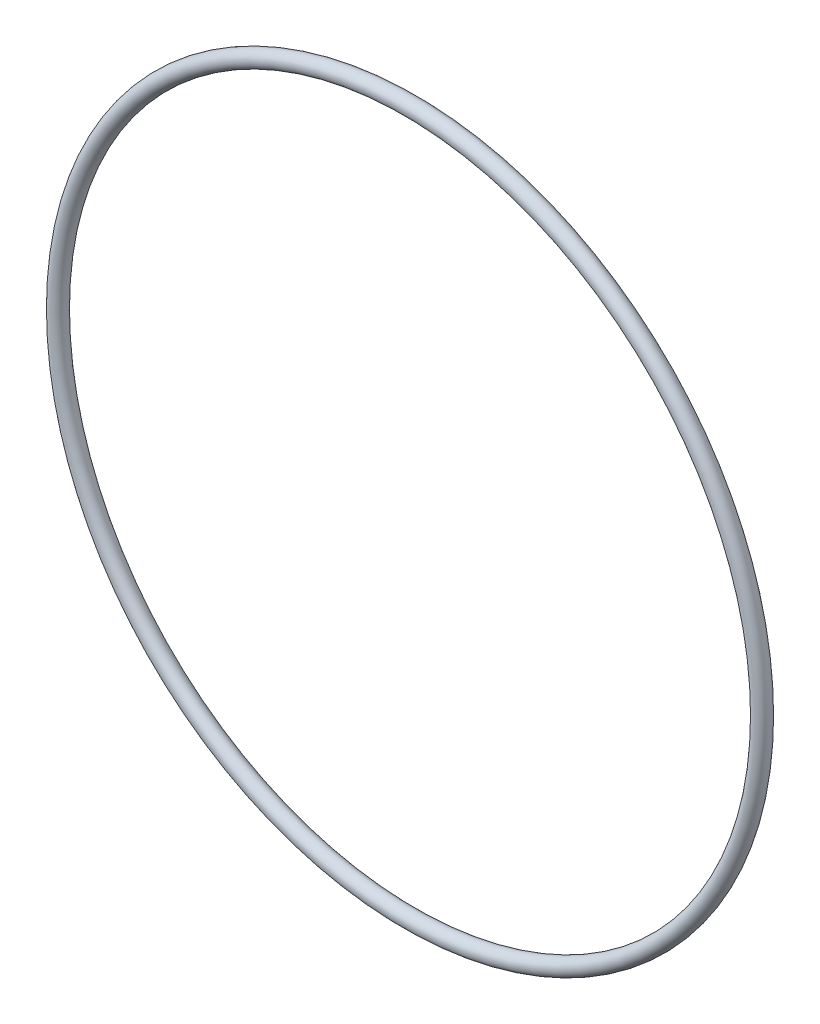
ISO-10303-21;
HEADER;
FILE_DESCRIPTION(('STEP AP214'),'2;1');
FILE_NAME('part.step','',(''),(''),'','','');
FILE_SCHEMA(('AUTOMOTIVE_DESIGN { 1 0 10303 214 1 1 1 1 }'));
ENDSEC;
DATA;
#1=APPLICATION_CONTEXT('core data for automotive mechanical design processes');
#2=APPLICATION_PROTOCOL_DEFINITION('international standard','automotive_design',2000,#1);
#3=PRODUCT_CONTEXT('',#1,'mechanical');
#4=PRODUCT('Part','Part','',(#3));
#5=PRODUCT_RELATED_PRODUCT_CATEGORY('part','',(#4));
#6=PRODUCT_DEFINITION_FORMATION('','',#4);
#7=PRODUCT_DEFINITION_CONTEXT('part definition',#1,'design');
#8=PRODUCT_DEFINITION('design','',#6,#7);
#9=PRODUCT_DEFINITION_SHAPE('','',#8);
#10=(LENGTH_UNIT() NAMED_UNIT(*) SI_UNIT(.MILLI.,.METRE.));
#11=(NAMED_UNIT(*) PLANE_ANGLE_UNIT() SI_UNIT($,.RADIAN.));
#12=(NAMED_UNIT(*) SI_UNIT($,.STERADIAN.) SOLID_ANGLE_UNIT());
#13=UNCERTAINTY_MEASURE_WITH_UNIT(LENGTH_MEASURE(1.E-05),#10,'distance_accuracy_value','');
#14=(GEOMETRIC_REPRESENTATION_CONTEXT(3) GLOBAL_UNCERTAINTY_ASSIGNED_CONTEXT((#13)) GLOBAL_UNIT_ASSIGNED_CONTEXT((#10,
#11,#12)) REPRESENTATION_CONTEXT('',''));
#15=CARTESIAN_POINT('',(0.,0.,0.));
#16=DIRECTION('',(0.,0.,1.));
#17=DIRECTION('',(1.,0.,0.));
#18=AXIS2_PLACEMENT_3D('',#15,#16,#17);
#19=CARTESIAN_POINT('',(0.,0.,0.));
#20=DIRECTION('',(0.,0.,1.));
#21=DIRECTION('',(1.,0.,0.));
#22=AXIS2_PLACEMENT_3D('',#19,#20,#21);
#23=TOROIDAL_SURFACE('',#22,76.1746,1.76529999999999);
#24=CARTESIAN_POINT('',(77.9399,0.,0.));
#25=VERTEX_POINT('',#24);
#26=VERTEX_LOOP('',#25);
#27=FACE_BOUND('',#26,.T.);
#28=ADVANCED_FACE('F28',(#27),#23,.T.);
#29=CLOSED_SHELL('',(#28));
#30=MANIFOLD_SOLID_BREP('B2',#29);
#31=ADVANCED_BREP_SHAPE_REPRESENTATION('',(#18,#30),#14);
#32=SHAPE_DEFINITION_REPRESENTATION(#9,#31);
ENDSEC;
END-ISO-10303-21;
